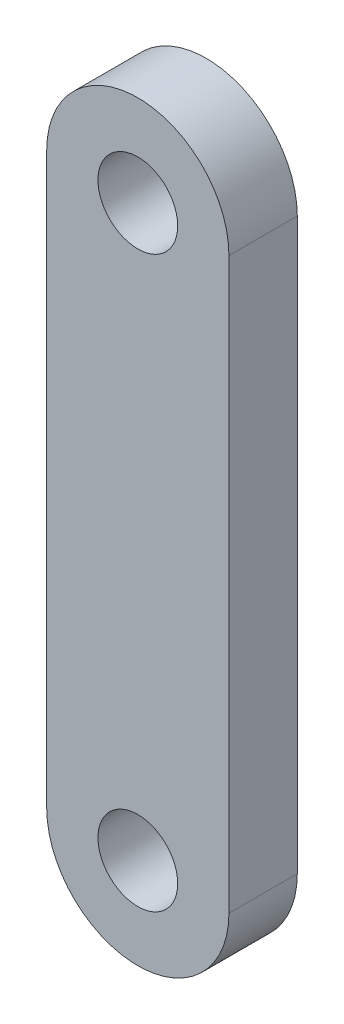
ISO-10303-21;
HEADER;
FILE_DESCRIPTION(('STEP AP214'),'2;1');
FILE_NAME('part.step','',(''),(''),'','','');
FILE_SCHEMA(('AUTOMOTIVE_DESIGN { 1 0 10303 214 1 1 1 1 }'));
ENDSEC;
DATA;
#1=APPLICATION_CONTEXT('core data for automotive mechanical design processes');
#2=APPLICATION_PROTOCOL_DEFINITION('international standard','automotive_design',2000,#1);
#3=PRODUCT_CONTEXT('',#1,'mechanical');
#4=PRODUCT('Part','Part','',(#3));
#5=PRODUCT_RELATED_PRODUCT_CATEGORY('part','',(#4));
#6=PRODUCT_DEFINITION_FORMATION('','',#4);
#7=PRODUCT_DEFINITION_CONTEXT('part definition',#1,'design');
#8=PRODUCT_DEFINITION('design','',#6,#7);
#9=PRODUCT_DEFINITION_SHAPE('','',#8);
#10=(LENGTH_UNIT() NAMED_UNIT(*) SI_UNIT(.MILLI.,.METRE.));
#11=(NAMED_UNIT(*) PLANE_ANGLE_UNIT() SI_UNIT($,.RADIAN.));
#12=(NAMED_UNIT(*) SI_UNIT($,.STERADIAN.) SOLID_ANGLE_UNIT());
#13=UNCERTAINTY_MEASURE_WITH_UNIT(LENGTH_MEASURE(1.E-05),#10,'distance_accuracy_value','');
#14=(GEOMETRIC_REPRESENTATION_CONTEXT(3) GLOBAL_UNCERTAINTY_ASSIGNED_CONTEXT((#13)) GLOBAL_UNIT_ASSIGNED_CONTEXT((#10,
#11,#12)) REPRESENTATION_CONTEXT('',''));
#15=CARTESIAN_POINT('',(0.,0.,0.));
#16=DIRECTION('',(0.,0.,1.));
#17=DIRECTION('',(1.,0.,0.));
#18=AXIS2_PLACEMENT_3D('',#15,#16,#17);
#19=CARTESIAN_POINT('',(0.,12.5,3.));
#20=DIRECTION('',(0.,0.,1.));
#21=DIRECTION('',(1.,0.,0.));
#22=AXIS2_PLACEMENT_3D('',#19,#20,#21);
#23=PLANE('',#22);
#24=CARTESIAN_POINT('',(0.,12.5,3.));
#25=DIRECTION('',(0.,0.,1.));
#26=DIRECTION('',(1.,0.,0.));
#27=AXIS2_PLACEMENT_3D('',#24,#25,#26);
#28=CIRCLE('',#27,1.75);
#29=CARTESIAN_POINT('',(1.74999999999999,12.5,3.));
#30=VERTEX_POINT('',#29);
#31=EDGE_CURVE('E118',#30,#30,#28,.T.);
#32=ORIENTED_EDGE('',*,*,#31,.F.);
#33=EDGE_LOOP('',(#32));
#34=FACE_BOUND('',#33,.T.);
#35=CARTESIAN_POINT('',(0.,12.5,3.));
#36=DIRECTION('',(0.,0.,1.));
#37=DIRECTION('',(1.,0.,0.));
#38=AXIS2_PLACEMENT_3D('',#35,#36,#37);
#39=CIRCLE('',#38,3.99999999999999);
#40=CARTESIAN_POINT('',(3.99999999999999,12.5,3.));
#41=VERTEX_POINT('',#40);
#42=CARTESIAN_POINT('',(-4.,12.5,3.));
#43=VERTEX_POINT('',#42);
#44=EDGE_CURVE('E98',#41,#43,#39,.T.);
#45=ORIENTED_EDGE('',*,*,#44,.T.);
#46=DIRECTION('',(0.,-1.,0.));
#47=VECTOR('',#46,1.);
#48=CARTESIAN_POINT('',(-4.,12.5,3.));
#49=LINE('',#48,#47);
#50=CARTESIAN_POINT('',(-3.99999999999999,-12.5,3.));
#51=VERTEX_POINT('',#50);
#52=EDGE_CURVE('E93',#43,#51,#49,.T.);
#53=ORIENTED_EDGE('',*,*,#52,.T.);
#54=CARTESIAN_POINT('',(0.,-12.5,3.));
#55=DIRECTION('',(0.,0.,1.));
#56=DIRECTION('',(1.,0.,0.));
#57=AXIS2_PLACEMENT_3D('',#54,#55,#56);
#58=CIRCLE('',#57,3.99999999999999);
#59=CARTESIAN_POINT('',(4.,-12.5,3.));
#60=VERTEX_POINT('',#59);
#61=EDGE_CURVE('E96',#51,#60,#58,.T.);
#62=ORIENTED_EDGE('',*,*,#61,.T.);
#63=DIRECTION('',(0.,1.,0.));
#64=VECTOR('',#63,1.);
#65=CARTESIAN_POINT('',(3.99999999999999,12.5,3.));
#66=LINE('',#65,#64);
#67=EDGE_CURVE('E63',#60,#41,#66,.T.);
#68=ORIENTED_EDGE('',*,*,#67,.T.);
#69=EDGE_LOOP('',(#45,#53,#62,#68));
#70=FACE_BOUND('',#69,.T.);
#71=CARTESIAN_POINT('',(0.,-12.5,3.));
#72=DIRECTION('',(0.,0.,1.));
#73=DIRECTION('',(1.,0.,0.));
#74=AXIS2_PLACEMENT_3D('',#71,#72,#73);
#75=CIRCLE('',#74,1.75);
#76=CARTESIAN_POINT('',(1.75,-12.5,3.));
#77=VERTEX_POINT('',#76);
#78=EDGE_CURVE('E140',#77,#77,#75,.T.);
#79=ORIENTED_EDGE('',*,*,#78,.F.);
#80=EDGE_LOOP('',(#79));
#81=FACE_BOUND('',#80,.T.);
#82=ADVANCED_FACE('F45',(#34,#70,#81),#23,.T.);
#83=CARTESIAN_POINT('',(0.,12.5,0.));
#84=DIRECTION('',(0.,0.,1.));
#85=DIRECTION('',(1.,0.,0.));
#86=AXIS2_PLACEMENT_3D('',#83,#84,#85);
#87=PLANE('',#86);
#88=CARTESIAN_POINT('',(0.,12.5,0.));
#89=DIRECTION('',(0.,0.,1.));
#90=DIRECTION('',(1.,0.,0.));
#91=AXIS2_PLACEMENT_3D('',#88,#89,#90);
#92=CIRCLE('',#91,3.99999999999999);
#93=CARTESIAN_POINT('',(3.99999999999999,12.5,0.));
#94=VERTEX_POINT('',#93);
#95=CARTESIAN_POINT('',(-4.,12.5,0.));
#96=VERTEX_POINT('',#95);
#97=EDGE_CURVE('E114',#94,#96,#92,.T.);
#98=ORIENTED_EDGE('',*,*,#97,.F.);
#99=DIRECTION('',(0.,1.,0.));
#100=VECTOR('',#99,1.);
#101=CARTESIAN_POINT('',(3.99999999999999,12.5,0.));
#102=LINE('',#101,#100);
#103=CARTESIAN_POINT('',(4.,-12.5,0.));
#104=VERTEX_POINT('',#103);
#105=EDGE_CURVE('E86',#104,#94,#102,.T.);
#106=ORIENTED_EDGE('',*,*,#105,.F.);
#107=CARTESIAN_POINT('',(0.,-12.5,0.));
#108=DIRECTION('',(0.,0.,1.));
#109=DIRECTION('',(1.,0.,0.));
#110=AXIS2_PLACEMENT_3D('',#107,#108,#109);
#111=CIRCLE('',#110,3.99999999999999);
#112=CARTESIAN_POINT('',(-3.99999999999999,-12.5,0.));
#113=VERTEX_POINT('',#112);
#114=EDGE_CURVE('E80',#113,#104,#111,.T.);
#115=ORIENTED_EDGE('',*,*,#114,.F.);
#116=DIRECTION('',(0.,-1.,0.));
#117=VECTOR('',#116,1.);
#118=CARTESIAN_POINT('',(-4.,12.5,0.));
#119=LINE('',#118,#117);
#120=EDGE_CURVE('E103',#96,#113,#119,.T.);
#121=ORIENTED_EDGE('',*,*,#120,.F.);
#122=EDGE_LOOP('',(#98,#106,#115,#121));
#123=FACE_BOUND('',#122,.T.);
#124=CARTESIAN_POINT('',(0.,12.5,0.));
#125=DIRECTION('',(0.,0.,1.));
#126=DIRECTION('',(1.,0.,0.));
#127=AXIS2_PLACEMENT_3D('',#124,#125,#126);
#128=CIRCLE('',#127,1.75);
#129=CARTESIAN_POINT('',(1.74999999999999,12.5,0.));
#130=VERTEX_POINT('',#129);
#131=EDGE_CURVE('E136',#130,#130,#128,.T.);
#132=ORIENTED_EDGE('',*,*,#131,.T.);
#133=EDGE_LOOP('',(#132));
#134=FACE_BOUND('',#133,.T.);
#135=CARTESIAN_POINT('',(0.,-12.5,0.));
#136=DIRECTION('',(0.,0.,1.));
#137=DIRECTION('',(1.,0.,0.));
#138=AXIS2_PLACEMENT_3D('',#135,#136,#137);
#139=CIRCLE('',#138,1.75);
#140=CARTESIAN_POINT('',(1.75,-12.5,0.));
#141=VERTEX_POINT('',#140);
#142=EDGE_CURVE('E144',#141,#141,#139,.T.);
#143=ORIENTED_EDGE('',*,*,#142,.T.);
#144=EDGE_LOOP('',(#143));
#145=FACE_BOUND('',#144,.T.);
#146=ADVANCED_FACE('F131',(#123,#134,#145),#87,.F.);
#147=CARTESIAN_POINT('',(0.,12.5,3.));
#148=DIRECTION('',(0.,0.,-1.));
#149=DIRECTION('',(-1.,0.,0.));
#150=AXIS2_PLACEMENT_3D('',#147,#148,#149);
#151=CYLINDRICAL_SURFACE('',#150,3.99999999999999);
#152=ORIENTED_EDGE('',*,*,#97,.T.);
#153=DIRECTION('',(0.,0.,-1.));
#154=VECTOR('',#153,1.);
#155=CARTESIAN_POINT('',(-4.,12.5,3.));
#156=LINE('',#155,#154);
#157=EDGE_CURVE('E11',#43,#96,#156,.T.);
#158=ORIENTED_EDGE('',*,*,#157,.F.);
#159=ORIENTED_EDGE('',*,*,#44,.F.);
#160=DIRECTION('',(0.,0.,-1.));
#161=VECTOR('',#160,1.);
#162=CARTESIAN_POINT('',(3.99999999999999,12.5,3.));
#163=LINE('',#162,#161);
#164=EDGE_CURVE('E110',#41,#94,#163,.T.);
#165=ORIENTED_EDGE('',*,*,#164,.T.);
#166=EDGE_LOOP('',(#152,#158,#159,#165));
#167=FACE_BOUND('',#166,.T.);
#168=ADVANCED_FACE('F47',(#167),#151,.T.);
#169=CARTESIAN_POINT('',(-4.,12.5,3.));
#170=DIRECTION('',(1.,0.,0.));
#171=DIRECTION('',(0.,1.,0.));
#172=AXIS2_PLACEMENT_3D('',#169,#170,#171);
#173=PLANE('',#172);
#174=ORIENTED_EDGE('',*,*,#120,.T.);
#175=DIRECTION('',(0.,0.,-1.));
#176=VECTOR('',#175,1.);
#177=CARTESIAN_POINT('',(-3.99999999999999,-12.5,3.));
#178=LINE('',#177,#176);
#179=EDGE_CURVE('E55',#51,#113,#178,.T.);
#180=ORIENTED_EDGE('',*,*,#179,.F.);
#181=ORIENTED_EDGE('',*,*,#52,.F.);
#182=ORIENTED_EDGE('',*,*,#157,.T.);
#183=EDGE_LOOP('',(#174,#180,#181,#182));
#184=FACE_BOUND('',#183,.T.);
#185=ADVANCED_FACE('F102',(#184),#173,.F.);
#186=CARTESIAN_POINT('',(0.,-12.5,3.));
#187=DIRECTION('',(0.,0.,-1.));
#188=DIRECTION('',(-1.,0.,0.));
#189=AXIS2_PLACEMENT_3D('',#186,#187,#188);
#190=CYLINDRICAL_SURFACE('',#189,3.99999999999999);
#191=ORIENTED_EDGE('',*,*,#114,.T.);
#192=DIRECTION('',(0.,0.,-1.));
#193=VECTOR('',#192,1.);
#194=CARTESIAN_POINT('',(4.,-12.5,3.));
#195=LINE('',#194,#193);
#196=EDGE_CURVE('E105',#60,#104,#195,.T.);
#197=ORIENTED_EDGE('',*,*,#196,.F.);
#198=ORIENTED_EDGE('',*,*,#61,.F.);
#199=ORIENTED_EDGE('',*,*,#179,.T.);
#200=EDGE_LOOP('',(#191,#197,#198,#199));
#201=FACE_BOUND('',#200,.T.);
#202=ADVANCED_FACE('F106',(#201),#190,.T.);
#203=CARTESIAN_POINT('',(3.99999999999999,12.5,3.));
#204=DIRECTION('',(-1.,0.,0.));
#205=DIRECTION('',(0.,-1.,0.));
#206=AXIS2_PLACEMENT_3D('',#203,#204,#205);
#207=PLANE('',#206);
#208=ORIENTED_EDGE('',*,*,#105,.T.);
#209=ORIENTED_EDGE('',*,*,#164,.F.);
#210=ORIENTED_EDGE('',*,*,#67,.F.);
#211=ORIENTED_EDGE('',*,*,#196,.T.);
#212=EDGE_LOOP('',(#208,#209,#210,#211));
#213=FACE_BOUND('',#212,.T.);
#214=ADVANCED_FACE('F128',(#213),#207,.F.);
#215=CARTESIAN_POINT('',(0.,12.5,3.));
#216=DIRECTION('',(0.,0.,-1.));
#217=DIRECTION('',(-1.,0.,0.));
#218=AXIS2_PLACEMENT_3D('',#215,#216,#217);
#219=CYLINDRICAL_SURFACE('',#218,1.75);
#220=ORIENTED_EDGE('',*,*,#31,.T.);
#221=EDGE_LOOP('',(#220));
#222=FACE_BOUND('',#221,.T.);
#223=ORIENTED_EDGE('',*,*,#131,.F.);
#224=EDGE_LOOP('',(#223));
#225=FACE_BOUND('',#224,.T.);
#226=ADVANCED_FACE('F163',(#222,#225),#219,.F.);
#227=CARTESIAN_POINT('',(0.,-12.5,3.));
#228=DIRECTION('',(0.,0.,-1.));
#229=DIRECTION('',(-1.,0.,0.));
#230=AXIS2_PLACEMENT_3D('',#227,#228,#229);
#231=CYLINDRICAL_SURFACE('',#230,1.75);
#232=ORIENTED_EDGE('',*,*,#78,.T.);
#233=EDGE_LOOP('',(#232));
#234=FACE_BOUND('',#233,.T.);
#235=ORIENTED_EDGE('',*,*,#142,.F.);
#236=EDGE_LOOP('',(#235));
#237=FACE_BOUND('',#236,.T.);
#238=ADVANCED_FACE('F152',(#234,#237),#231,.F.);
#239=CLOSED_SHELL('',(#82,#146,#168,#185,#202,#214,#226,#238));
#240=MANIFOLD_SOLID_BREP('B2',#239);
#241=ADVANCED_BREP_SHAPE_REPRESENTATION('',(#18,#240),#14);
#242=SHAPE_DEFINITION_REPRESENTATION(#9,#241);
ENDSEC;
END-ISO-10303-21;
